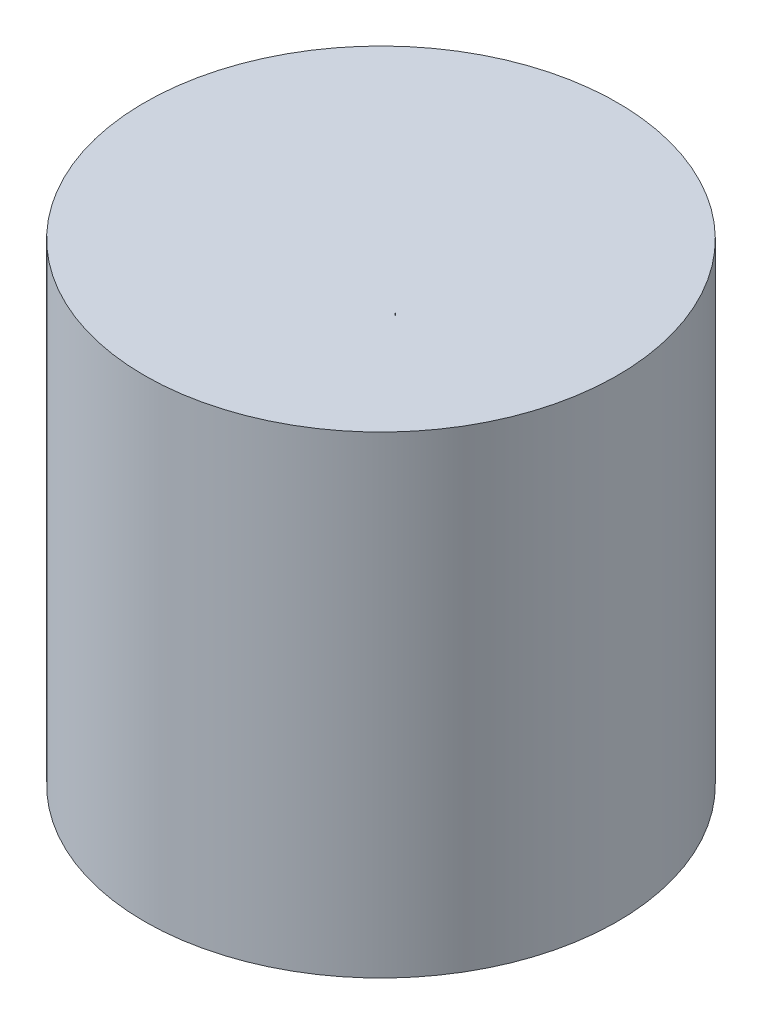
ISO-10303-21;
HEADER;
FILE_DESCRIPTION(('STEP AP214'),'2;1');
FILE_NAME('part.step','',(''),(''),'','','');
FILE_SCHEMA(('AUTOMOTIVE_DESIGN { 1 0 10303 214 1 1 1 1 }'));
ENDSEC;
DATA;
#1=APPLICATION_CONTEXT('core data for automotive mechanical design processes');
#2=APPLICATION_PROTOCOL_DEFINITION('international standard','automotive_design',2000,#1);
#3=PRODUCT_CONTEXT('',#1,'mechanical');
#4=PRODUCT('Part','Part','',(#3));
#5=PRODUCT_RELATED_PRODUCT_CATEGORY('part','',(#4));
#6=PRODUCT_DEFINITION_FORMATION('','',#4);
#7=PRODUCT_DEFINITION_CONTEXT('part definition',#1,'design');
#8=PRODUCT_DEFINITION('design','',#6,#7);
#9=PRODUCT_DEFINITION_SHAPE('','',#8);
#10=(LENGTH_UNIT() NAMED_UNIT(*) SI_UNIT(.MILLI.,.METRE.));
#11=(NAMED_UNIT(*) PLANE_ANGLE_UNIT() SI_UNIT($,.RADIAN.));
#12=(NAMED_UNIT(*) SI_UNIT($,.STERADIAN.) SOLID_ANGLE_UNIT());
#13=UNCERTAINTY_MEASURE_WITH_UNIT(LENGTH_MEASURE(1.E-05),#10,'distance_accuracy_value','');
#14=(GEOMETRIC_REPRESENTATION_CONTEXT(3) GLOBAL_UNCERTAINTY_ASSIGNED_CONTEXT((#13)) GLOBAL_UNIT_ASSIGNED_CONTEXT((#10,
#11,#12)) REPRESENTATION_CONTEXT('',''));
#15=CARTESIAN_POINT('',(0.,0.,0.));
#16=DIRECTION('',(0.,0.,1.));
#17=DIRECTION('',(1.,0.,0.));
#18=AXIS2_PLACEMENT_3D('',#15,#16,#17);
#19=CARTESIAN_POINT('',(0.,12.7,0.));
#20=DIRECTION('',(0.,-1.,0.));
#21=DIRECTION('',(0.,0.,-1.));
#22=AXIS2_PLACEMENT_3D('',#19,#20,#21);
#23=CYLINDRICAL_SURFACE('',#22,6.35);
#24=CARTESIAN_POINT('',(0.,12.7,0.));
#25=DIRECTION('',(0.,1.,0.));
#26=DIRECTION('',(0.,0.,1.));
#27=AXIS2_PLACEMENT_3D('',#24,#25,#26);
#28=CIRCLE('',#27,6.35);
#29=CARTESIAN_POINT('',(0.,12.7,6.35));
#30=VERTEX_POINT('',#29);
#31=EDGE_CURVE('E11',#30,#30,#28,.T.);
#32=ORIENTED_EDGE('',*,*,#31,.F.);
#33=EDGE_LOOP('',(#32));
#34=FACE_BOUND('',#33,.T.);
#35=CARTESIAN_POINT('',(0.,0.,0.));
#36=DIRECTION('',(0.,1.,0.));
#37=DIRECTION('',(0.,0.,1.));
#38=AXIS2_PLACEMENT_3D('',#35,#36,#37);
#39=CIRCLE('',#38,6.35);
#40=CARTESIAN_POINT('',(0.,0.,6.35));
#41=VERTEX_POINT('',#40);
#42=EDGE_CURVE('E44',#41,#41,#39,.T.);
#43=ORIENTED_EDGE('',*,*,#42,.T.);
#44=EDGE_LOOP('',(#43));
#45=FACE_BOUND('',#44,.T.);
#46=ADVANCED_FACE('F41',(#34,#45),#23,.T.);
#47=CARTESIAN_POINT('',(0.,12.7,0.));
#48=DIRECTION('',(0.,1.,0.));
#49=DIRECTION('',(0.,0.,1.));
#50=AXIS2_PLACEMENT_3D('',#47,#48,#49);
#51=PLANE('',#50);
#52=ORIENTED_EDGE('',*,*,#31,.T.);
#53=EDGE_LOOP('',(#52));
#54=FACE_BOUND('',#53,.T.);
#55=CARTESIAN_POINT('',(2.20364471333607,12.7,-0.363962393700215));
#56=DIRECTION('',(0.,1.,0.));
#57=DIRECTION('',(0.,0.,-1.));
#58=AXIS2_PLACEMENT_3D('',#55,#56,#57);
#59=ELLIPSE('',#58,2.04841275554783,0.760235661852807);
#60=CARTESIAN_POINT('',(1.88435225369435,12.7,1.49502968579492));
#61=VERTEX_POINT('',#60);
#62=CARTESIAN_POINT('',(1.96742430174379,12.7,1.58305699330002));
#63=VERTEX_POINT('',#62);
#64=EDGE_CURVE('E70',#61,#63,#59,.T.);
#65=ORIENTED_EDGE('',*,*,#64,.F.);
#66=CARTESIAN_POINT('',(1.189997164199,12.7,2.23350945096353));
#67=DIRECTION('',(0.,1.,0.));
#68=DIRECTION('',(0.,0.,1.));
#69=AXIS2_PLACEMENT_3D('',#66,#67,#68);
#70=CIRCLE('',#69,1.01364754913707);
#71=EDGE_CURVE('E78',#63,#61,#70,.T.);
#72=ORIENTED_EDGE('',*,*,#71,.F.);
#73=EDGE_LOOP('',(#65,#72));
#74=FACE_BOUND('',#73,.T.);
#75=ADVANCED_FACE('F77',(#54,#74),#51,.T.);
#76=CARTESIAN_POINT('',(0.,0.,0.));
#77=DIRECTION('',(0.,1.,0.));
#78=DIRECTION('',(0.,0.,1.));
#79=AXIS2_PLACEMENT_3D('',#76,#77,#78);
#80=PLANE('',#79);
#81=ORIENTED_EDGE('',*,*,#42,.F.);
#82=EDGE_LOOP('',(#81));
#83=FACE_BOUND('',#82,.T.);
#84=CARTESIAN_POINT('',(2.20364471333607,0.,-0.363962393700215));
#85=DIRECTION('',(0.,1.,0.));
#86=DIRECTION('',(0.,0.,-1.));
#87=AXIS2_PLACEMENT_3D('',#84,#85,#86);
#88=ELLIPSE('',#87,2.04841275554783,0.760235661852807);
#89=CARTESIAN_POINT('',(1.88435225369435,0.,1.49502968579492));
#90=VERTEX_POINT('',#89);
#91=CARTESIAN_POINT('',(1.96742430174379,0.,1.58305699330002));
#92=VERTEX_POINT('',#91);
#93=EDGE_CURVE('E72',#90,#92,#88,.T.);
#94=ORIENTED_EDGE('',*,*,#93,.T.);
#95=CARTESIAN_POINT('',(1.189997164199,0.,2.23350945096353));
#96=DIRECTION('',(0.,1.,0.));
#97=DIRECTION('',(0.,0.,1.));
#98=AXIS2_PLACEMENT_3D('',#95,#96,#97);
#99=CIRCLE('',#98,1.01364754913707);
#100=EDGE_CURVE('E85',#92,#90,#99,.T.);
#101=ORIENTED_EDGE('',*,*,#100,.T.);
#102=EDGE_LOOP('',(#94,#101));
#103=FACE_BOUND('',#102,.T.);
#104=ADVANCED_FACE('F94',(#83,#103),#80,.F.);
#105=CARTESIAN_POINT('',(2.20364471333607,2.54,-0.363962393700215));
#106=DIRECTION('',(0.,1.,0.));
#107=DIRECTION('',(0.,0.,-1.));
#108=AXIS2_PLACEMENT_3D('',#105,#106,#107);
#109=ELLIPSE('',#108,2.04841275554783,0.760235661852807);
#110=DIRECTION('',(0.,-1.,0.));
#111=VECTOR('',#110,1.);
#112=SURFACE_OF_LINEAR_EXTRUSION('',#109,#111);
#113=ORIENTED_EDGE('',*,*,#93,.F.);
#114=DIRECTION('',(0.,-1.,0.));
#115=VECTOR('',#114,1.);
#116=CARTESIAN_POINT('',(1.88435225369435,2.54,1.49502968579492));
#117=LINE('',#116,#115);
#118=EDGE_CURVE('E64',#61,#90,#117,.T.);
#119=ORIENTED_EDGE('',*,*,#118,.F.);
#120=ORIENTED_EDGE('',*,*,#64,.T.);
#121=DIRECTION('',(0.,-1.,0.));
#122=VECTOR('',#121,1.);
#123=CARTESIAN_POINT('',(1.96742430174379,2.54,1.58305699330002));
#124=LINE('',#123,#122);
#125=EDGE_CURVE('E56',#63,#92,#124,.T.);
#126=ORIENTED_EDGE('',*,*,#125,.T.);
#127=EDGE_LOOP('',(#113,#119,#120,#126));
#128=FACE_BOUND('',#127,.T.);
#129=ADVANCED_FACE('F69',(#128),#112,.T.);
#130=CARTESIAN_POINT('',(1.189997164199,2.54,2.23350945096353));
#131=DIRECTION('',(0.,-1.,0.));
#132=DIRECTION('',(0.,0.,-1.));
#133=AXIS2_PLACEMENT_3D('',#130,#131,#132);
#134=CYLINDRICAL_SURFACE('',#133,1.01364754913707);
#135=ORIENTED_EDGE('',*,*,#100,.F.);
#136=ORIENTED_EDGE('',*,*,#125,.F.);
#137=ORIENTED_EDGE('',*,*,#71,.T.);
#138=ORIENTED_EDGE('',*,*,#118,.T.);
#139=EDGE_LOOP('',(#135,#136,#137,#138));
#140=FACE_BOUND('',#139,.T.);
#141=ADVANCED_FACE('F81',(#140),#134,.F.);
#142=CLOSED_SHELL('',(#46,#75,#104,#129,#141));
#143=MANIFOLD_SOLID_BREP('B2',#142);
#144=ADVANCED_BREP_SHAPE_REPRESENTATION('',(#18,#143),#14);
#145=SHAPE_DEFINITION_REPRESENTATION(#9,#144);
ENDSEC;
END-ISO-10303-21;
